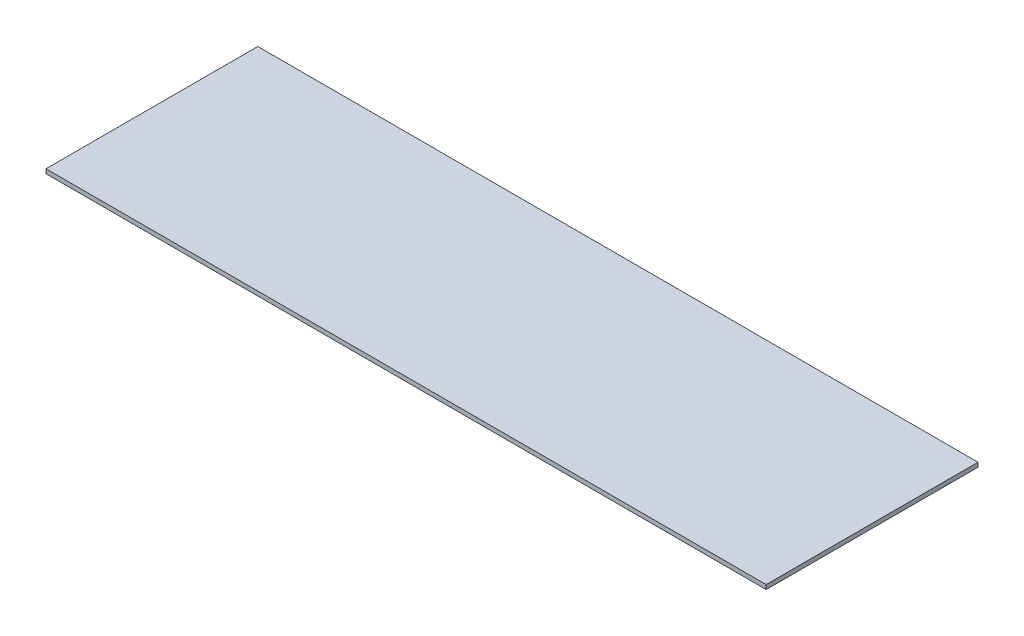
ISO-10303-21;
HEADER;
FILE_DESCRIPTION(('STEP AP214'),'2;1');
FILE_NAME('part.step','',(''),(''),'','','');
FILE_SCHEMA(('AUTOMOTIVE_DESIGN { 1 0 10303 214 1 1 1 1 }'));
ENDSEC;
DATA;
#1=APPLICATION_CONTEXT('core data for automotive mechanical design processes');
#2=APPLICATION_PROTOCOL_DEFINITION('international standard','automotive_design',2000,#1);
#3=PRODUCT_CONTEXT('',#1,'mechanical');
#4=PRODUCT('Part','Part','',(#3));
#5=PRODUCT_RELATED_PRODUCT_CATEGORY('part','',(#4));
#6=PRODUCT_DEFINITION_FORMATION('','',#4);
#7=PRODUCT_DEFINITION_CONTEXT('part definition',#1,'design');
#8=PRODUCT_DEFINITION('design','',#6,#7);
#9=PRODUCT_DEFINITION_SHAPE('','',#8);
#10=(LENGTH_UNIT() NAMED_UNIT(*) SI_UNIT(.MILLI.,.METRE.));
#11=(NAMED_UNIT(*) PLANE_ANGLE_UNIT() SI_UNIT($,.RADIAN.));
#12=(NAMED_UNIT(*) SI_UNIT($,.STERADIAN.) SOLID_ANGLE_UNIT());
#13=UNCERTAINTY_MEASURE_WITH_UNIT(LENGTH_MEASURE(1.E-05),#10,'distance_accuracy_value','');
#14=(GEOMETRIC_REPRESENTATION_CONTEXT(3) GLOBAL_UNCERTAINTY_ASSIGNED_CONTEXT((#13)) GLOBAL_UNIT_ASSIGNED_CONTEXT((#10,
#11,#12)) REPRESENTATION_CONTEXT('',''));
#15=CARTESIAN_POINT('',(0.,0.,0.));
#16=DIRECTION('',(0.,0.,1.));
#17=DIRECTION('',(1.,0.,0.));
#18=AXIS2_PLACEMENT_3D('',#15,#16,#17);
#19=CARTESIAN_POINT('',(0.,1.2954,0.));
#20=DIRECTION('',(1.,0.,0.));
#21=DIRECTION('',(0.,0.,-1.));
#22=AXIS2_PLACEMENT_3D('',#19,#20,#21);
#23=PLANE('',#22);
#24=DIRECTION('',(0.,0.,1.));
#25=VECTOR('',#24,1.);
#26=CARTESIAN_POINT('',(0.,0.,0.));
#27=LINE('',#26,#25);
#28=CARTESIAN_POINT('',(0.,0.,-63.5));
#29=VERTEX_POINT('',#28);
#30=CARTESIAN_POINT('',(0.,0.,0.));
#31=VERTEX_POINT('',#30);
#32=EDGE_CURVE('E96',#29,#31,#27,.T.);
#33=ORIENTED_EDGE('',*,*,#32,.T.);
#34=DIRECTION('',(0.,-1.,0.));
#35=VECTOR('',#34,1.);
#36=CARTESIAN_POINT('',(0.,1.2954,0.));
#37=LINE('',#36,#35);
#38=CARTESIAN_POINT('',(0.,1.2954,0.));
#39=VERTEX_POINT('',#38);
#40=EDGE_CURVE('E11',#39,#31,#37,.T.);
#41=ORIENTED_EDGE('',*,*,#40,.F.);
#42=DIRECTION('',(0.,0.,1.));
#43=VECTOR('',#42,1.);
#44=CARTESIAN_POINT('',(0.,1.2954,0.));
#45=LINE('',#44,#43);
#46=CARTESIAN_POINT('',(0.,1.2954,-63.5));
#47=VERTEX_POINT('',#46);
#48=EDGE_CURVE('E84',#47,#39,#45,.T.);
#49=ORIENTED_EDGE('',*,*,#48,.F.);
#50=DIRECTION('',(0.,-1.,0.));
#51=VECTOR('',#50,1.);
#52=CARTESIAN_POINT('',(0.,1.2954,-63.5));
#53=LINE('',#52,#51);
#54=EDGE_CURVE('E92',#47,#29,#53,.T.);
#55=ORIENTED_EDGE('',*,*,#54,.T.);
#56=EDGE_LOOP('',(#33,#41,#49,#55));
#57=FACE_BOUND('',#56,.T.);
#58=ADVANCED_FACE('F33',(#57),#23,.F.);
#59=CARTESIAN_POINT('',(0.,1.2954,0.));
#60=DIRECTION('',(0.,0.,-1.));
#61=DIRECTION('',(-1.,0.,0.));
#62=AXIS2_PLACEMENT_3D('',#59,#60,#61);
#63=PLANE('',#62);
#64=DIRECTION('',(1.,0.,0.));
#65=VECTOR('',#64,1.);
#66=CARTESIAN_POINT('',(0.,0.,0.));
#67=LINE('',#66,#65);
#68=CARTESIAN_POINT('',(215.9,0.,0.));
#69=VERTEX_POINT('',#68);
#70=EDGE_CURVE('E88',#31,#69,#67,.T.);
#71=ORIENTED_EDGE('',*,*,#70,.T.);
#72=DIRECTION('',(0.,-1.,0.));
#73=VECTOR('',#72,1.);
#74=CARTESIAN_POINT('',(215.9,1.2954,0.));
#75=LINE('',#74,#73);
#76=CARTESIAN_POINT('',(215.9,1.2954,0.));
#77=VERTEX_POINT('',#76);
#78=EDGE_CURVE('E41',#77,#69,#75,.T.);
#79=ORIENTED_EDGE('',*,*,#78,.F.);
#80=DIRECTION('',(1.,0.,0.));
#81=VECTOR('',#80,1.);
#82=CARTESIAN_POINT('',(0.,1.2954,0.));
#83=LINE('',#82,#81);
#84=EDGE_CURVE('E79',#39,#77,#83,.T.);
#85=ORIENTED_EDGE('',*,*,#84,.F.);
#86=ORIENTED_EDGE('',*,*,#40,.T.);
#87=EDGE_LOOP('',(#71,#79,#85,#86));
#88=FACE_BOUND('',#87,.T.);
#89=ADVANCED_FACE('F87',(#88),#63,.F.);
#90=CARTESIAN_POINT('',(215.9,1.2954,0.));
#91=DIRECTION('',(-1.,0.,0.));
#92=DIRECTION('',(0.,0.,1.));
#93=AXIS2_PLACEMENT_3D('',#90,#91,#92);
#94=PLANE('',#93);
#95=DIRECTION('',(0.,0.,-1.));
#96=VECTOR('',#95,1.);
#97=CARTESIAN_POINT('',(215.9,0.,0.));
#98=LINE('',#97,#96);
#99=CARTESIAN_POINT('',(215.9,0.,-63.5));
#100=VERTEX_POINT('',#99);
#101=EDGE_CURVE('E66',#69,#100,#98,.T.);
#102=ORIENTED_EDGE('',*,*,#101,.T.);
#103=DIRECTION('',(0.,-1.,0.));
#104=VECTOR('',#103,1.);
#105=CARTESIAN_POINT('',(215.9,1.2954,-63.5));
#106=LINE('',#105,#104);
#107=CARTESIAN_POINT('',(215.9,1.2954,-63.5));
#108=VERTEX_POINT('',#107);
#109=EDGE_CURVE('E89',#108,#100,#106,.T.);
#110=ORIENTED_EDGE('',*,*,#109,.F.);
#111=DIRECTION('',(0.,0.,-1.));
#112=VECTOR('',#111,1.);
#113=CARTESIAN_POINT('',(215.9,1.2954,0.));
#114=LINE('',#113,#112);
#115=EDGE_CURVE('E82',#77,#108,#114,.T.);
#116=ORIENTED_EDGE('',*,*,#115,.F.);
#117=ORIENTED_EDGE('',*,*,#78,.T.);
#118=EDGE_LOOP('',(#102,#110,#116,#117));
#119=FACE_BOUND('',#118,.T.);
#120=ADVANCED_FACE('F90',(#119),#94,.F.);
#121=CARTESIAN_POINT('',(0.,1.2954,-63.5));
#122=DIRECTION('',(0.,0.,1.));
#123=DIRECTION('',(1.,0.,0.));
#124=AXIS2_PLACEMENT_3D('',#121,#122,#123);
#125=PLANE('',#124);
#126=DIRECTION('',(-1.,0.,0.));
#127=VECTOR('',#126,1.);
#128=CARTESIAN_POINT('',(0.,0.,-63.5));
#129=LINE('',#128,#127);
#130=EDGE_CURVE('E72',#100,#29,#129,.T.);
#131=ORIENTED_EDGE('',*,*,#130,.T.);
#132=ORIENTED_EDGE('',*,*,#54,.F.);
#133=DIRECTION('',(-1.,0.,0.));
#134=VECTOR('',#133,1.);
#135=CARTESIAN_POINT('',(0.,1.2954,-63.5));
#136=LINE('',#135,#134);
#137=EDGE_CURVE('E49',#108,#47,#136,.T.);
#138=ORIENTED_EDGE('',*,*,#137,.F.);
#139=ORIENTED_EDGE('',*,*,#109,.T.);
#140=EDGE_LOOP('',(#131,#132,#138,#139));
#141=FACE_BOUND('',#140,.T.);
#142=ADVANCED_FACE('F103',(#141),#125,.F.);
#143=CARTESIAN_POINT('',(0.,1.2954,0.));
#144=DIRECTION('',(0.,-1.,0.));
#145=DIRECTION('',(0.,0.,-1.));
#146=AXIS2_PLACEMENT_3D('',#143,#144,#145);
#147=PLANE('',#146);
#148=ORIENTED_EDGE('',*,*,#48,.T.);
#149=ORIENTED_EDGE('',*,*,#84,.T.);
#150=ORIENTED_EDGE('',*,*,#115,.T.);
#151=ORIENTED_EDGE('',*,*,#137,.T.);
#152=EDGE_LOOP('',(#148,#149,#150,#151));
#153=FACE_BOUND('',#152,.T.);
#154=ADVANCED_FACE('F80',(#153),#147,.F.);
#155=CARTESIAN_POINT('',(0.,0.,0.));
#156=DIRECTION('',(0.,-1.,0.));
#157=DIRECTION('',(0.,0.,-1.));
#158=AXIS2_PLACEMENT_3D('',#155,#156,#157);
#159=PLANE('',#158);
#160=ORIENTED_EDGE('',*,*,#32,.F.);
#161=ORIENTED_EDGE('',*,*,#130,.F.);
#162=ORIENTED_EDGE('',*,*,#101,.F.);
#163=ORIENTED_EDGE('',*,*,#70,.F.);
#164=EDGE_LOOP('',(#160,#161,#162,#163));
#165=FACE_BOUND('',#164,.T.);
#166=ADVANCED_FACE('F106',(#165),#159,.T.);
#167=CLOSED_SHELL('',(#58,#89,#120,#142,#154,#166));
#168=MANIFOLD_SOLID_BREP('B2',#167);
#169=ADVANCED_BREP_SHAPE_REPRESENTATION('',(#18,#168),#14);
#170=SHAPE_DEFINITION_REPRESENTATION(#9,#169);
ENDSEC;
END-ISO-10303-21;
